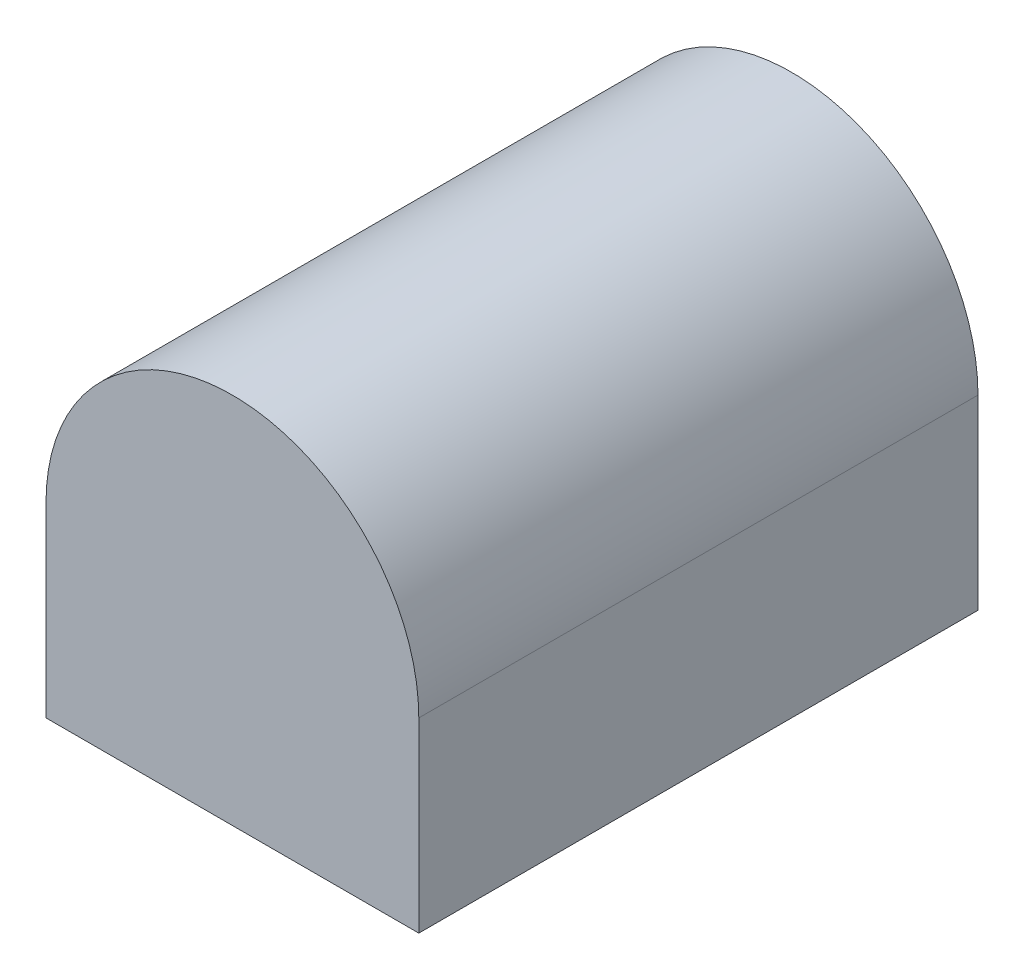
ISO-10303-21;
HEADER;
FILE_DESCRIPTION(('STEP AP214'),'2;1');
FILE_NAME('part.step','',(''),(''),'','','');
FILE_SCHEMA(('AUTOMOTIVE_DESIGN { 1 0 10303 214 1 1 1 1 }'));
ENDSEC;
DATA;
#1=APPLICATION_CONTEXT('core data for automotive mechanical design processes');
#2=APPLICATION_PROTOCOL_DEFINITION('international standard','automotive_design',2000,#1);
#3=PRODUCT_CONTEXT('',#1,'mechanical');
#4=PRODUCT('Part','Part','',(#3));
#5=PRODUCT_RELATED_PRODUCT_CATEGORY('part','',(#4));
#6=PRODUCT_DEFINITION_FORMATION('','',#4);
#7=PRODUCT_DEFINITION_CONTEXT('part definition',#1,'design');
#8=PRODUCT_DEFINITION('design','',#6,#7);
#9=PRODUCT_DEFINITION_SHAPE('','',#8);
#10=(LENGTH_UNIT() NAMED_UNIT(*) SI_UNIT(.MILLI.,.METRE.));
#11=(NAMED_UNIT(*) PLANE_ANGLE_UNIT() SI_UNIT($,.RADIAN.));
#12=(NAMED_UNIT(*) SI_UNIT($,.STERADIAN.) SOLID_ANGLE_UNIT());
#13=UNCERTAINTY_MEASURE_WITH_UNIT(LENGTH_MEASURE(1.E-05),#10,'distance_accuracy_value','');
#14=(GEOMETRIC_REPRESENTATION_CONTEXT(3) GLOBAL_UNCERTAINTY_ASSIGNED_CONTEXT((#13)) GLOBAL_UNIT_ASSIGNED_CONTEXT((#10,
#11,#12)) REPRESENTATION_CONTEXT('',''));
#15=CARTESIAN_POINT('',(0.,0.,0.));
#16=DIRECTION('',(0.,0.,1.));
#17=DIRECTION('',(1.,0.,0.));
#18=AXIS2_PLACEMENT_3D('',#15,#16,#17);
#19=CARTESIAN_POINT('',(-1.,0.,1.5));
#20=DIRECTION('',(1.,0.,0.));
#21=DIRECTION('',(0.,0.,-1.));
#22=AXIS2_PLACEMENT_3D('',#19,#20,#21);
#23=PLANE('',#22);
#24=DIRECTION('',(0.,-1.,0.));
#25=VECTOR('',#24,1.);
#26=CARTESIAN_POINT('',(-1.,0.,-1.5));
#27=LINE('',#26,#25);
#28=CARTESIAN_POINT('',(-1.,1.,-1.5));
#29=VERTEX_POINT('',#28);
#30=CARTESIAN_POINT('',(-1.,0.,-1.5));
#31=VERTEX_POINT('',#30);
#32=EDGE_CURVE('E108',#29,#31,#27,.T.);
#33=ORIENTED_EDGE('',*,*,#32,.T.);
#34=DIRECTION('',(0.,0.,-1.));
#35=VECTOR('',#34,1.);
#36=CARTESIAN_POINT('',(-1.,0.,1.5));
#37=LINE('',#36,#35);
#38=CARTESIAN_POINT('',(-1.,0.,1.5));
#39=VERTEX_POINT('',#38);
#40=EDGE_CURVE('E11',#39,#31,#37,.T.);
#41=ORIENTED_EDGE('',*,*,#40,.F.);
#42=DIRECTION('',(0.,-1.,0.));
#43=VECTOR('',#42,1.);
#44=CARTESIAN_POINT('',(-1.,0.,1.5));
#45=LINE('',#44,#43);
#46=CARTESIAN_POINT('',(-1.,1.,1.5));
#47=VERTEX_POINT('',#46);
#48=EDGE_CURVE('E96',#47,#39,#45,.T.);
#49=ORIENTED_EDGE('',*,*,#48,.F.);
#50=DIRECTION('',(0.,0.,-1.));
#51=VECTOR('',#50,1.);
#52=CARTESIAN_POINT('',(-1.,1.,1.5));
#53=LINE('',#52,#51);
#54=EDGE_CURVE('E104',#47,#29,#53,.T.);
#55=ORIENTED_EDGE('',*,*,#54,.T.);
#56=EDGE_LOOP('',(#33,#41,#49,#55));
#57=FACE_BOUND('',#56,.T.);
#58=ADVANCED_FACE('F45',(#57),#23,.F.);
#59=CARTESIAN_POINT('',(-1.,0.,1.5));
#60=DIRECTION('',(0.,1.,0.));
#61=DIRECTION('',(-1.,0.,0.));
#62=AXIS2_PLACEMENT_3D('',#59,#60,#61);
#63=PLANE('',#62);
#64=DIRECTION('',(1.,0.,0.));
#65=VECTOR('',#64,1.);
#66=CARTESIAN_POINT('',(-1.,0.,-1.5));
#67=LINE('',#66,#65);
#68=CARTESIAN_POINT('',(1.,0.,-1.5));
#69=VERTEX_POINT('',#68);
#70=EDGE_CURVE('E100',#31,#69,#67,.T.);
#71=ORIENTED_EDGE('',*,*,#70,.T.);
#72=DIRECTION('',(0.,0.,-1.));
#73=VECTOR('',#72,1.);
#74=CARTESIAN_POINT('',(1.,0.,1.5));
#75=LINE('',#74,#73);
#76=CARTESIAN_POINT('',(1.,0.,1.5));
#77=VERTEX_POINT('',#76);
#78=EDGE_CURVE('E53',#77,#69,#75,.T.);
#79=ORIENTED_EDGE('',*,*,#78,.F.);
#80=DIRECTION('',(1.,0.,0.));
#81=VECTOR('',#80,1.);
#82=CARTESIAN_POINT('',(-1.,0.,1.5));
#83=LINE('',#82,#81);
#84=EDGE_CURVE('E91',#39,#77,#83,.T.);
#85=ORIENTED_EDGE('',*,*,#84,.F.);
#86=ORIENTED_EDGE('',*,*,#40,.T.);
#87=EDGE_LOOP('',(#71,#79,#85,#86));
#88=FACE_BOUND('',#87,.T.);
#89=ADVANCED_FACE('F99',(#88),#63,.F.);
#90=CARTESIAN_POINT('',(1.,1.,1.5));
#91=DIRECTION('',(-1.,0.,0.));
#92=DIRECTION('',(0.,-1.,0.));
#93=AXIS2_PLACEMENT_3D('',#90,#91,#92);
#94=PLANE('',#93);
#95=DIRECTION('',(0.,1.,0.));
#96=VECTOR('',#95,1.);
#97=CARTESIAN_POINT('',(1.,1.,-1.5));
#98=LINE('',#97,#96);
#99=CARTESIAN_POINT('',(1.,1.,-1.5));
#100=VERTEX_POINT('',#99);
#101=EDGE_CURVE('E78',#69,#100,#98,.T.);
#102=ORIENTED_EDGE('',*,*,#101,.T.);
#103=DIRECTION('',(0.,0.,-1.));
#104=VECTOR('',#103,1.);
#105=CARTESIAN_POINT('',(1.,1.,1.5));
#106=LINE('',#105,#104);
#107=CARTESIAN_POINT('',(1.,1.,1.5));
#108=VERTEX_POINT('',#107);
#109=EDGE_CURVE('E101',#108,#100,#106,.T.);
#110=ORIENTED_EDGE('',*,*,#109,.F.);
#111=DIRECTION('',(0.,1.,0.));
#112=VECTOR('',#111,1.);
#113=CARTESIAN_POINT('',(1.,1.,1.5));
#114=LINE('',#113,#112);
#115=EDGE_CURVE('E94',#77,#108,#114,.T.);
#116=ORIENTED_EDGE('',*,*,#115,.F.);
#117=ORIENTED_EDGE('',*,*,#78,.T.);
#118=EDGE_LOOP('',(#102,#110,#116,#117));
#119=FACE_BOUND('',#118,.T.);
#120=ADVANCED_FACE('F102',(#119),#94,.F.);
#121=CARTESIAN_POINT('',(0.,1.,1.5));
#122=DIRECTION('',(0.,0.,-1.));
#123=DIRECTION('',(-1.,0.,0.));
#124=AXIS2_PLACEMENT_3D('',#121,#122,#123);
#125=CYLINDRICAL_SURFACE('',#124,1.);
#126=CARTESIAN_POINT('',(0.,1.,-1.5));
#127=DIRECTION('',(0.,0.,1.));
#128=DIRECTION('',(1.,0.,0.));
#129=AXIS2_PLACEMENT_3D('',#126,#127,#128);
#130=CIRCLE('',#129,1.);
#131=EDGE_CURVE('E84',#100,#29,#130,.T.);
#132=ORIENTED_EDGE('',*,*,#131,.T.);
#133=ORIENTED_EDGE('',*,*,#54,.F.);
#134=CARTESIAN_POINT('',(0.,1.,1.5));
#135=DIRECTION('',(0.,0.,1.));
#136=DIRECTION('',(1.,0.,0.));
#137=AXIS2_PLACEMENT_3D('',#134,#135,#136);
#138=CIRCLE('',#137,1.);
#139=EDGE_CURVE('E61',#108,#47,#138,.T.);
#140=ORIENTED_EDGE('',*,*,#139,.F.);
#141=ORIENTED_EDGE('',*,*,#109,.T.);
#142=EDGE_LOOP('',(#132,#133,#140,#141));
#143=FACE_BOUND('',#142,.T.);
#144=ADVANCED_FACE('F115',(#143),#125,.T.);
#145=CARTESIAN_POINT('',(0.,1.,1.5));
#146=DIRECTION('',(0.,0.,1.));
#147=DIRECTION('',(1.,0.,0.));
#148=AXIS2_PLACEMENT_3D('',#145,#146,#147);
#149=PLANE('',#148);
#150=ORIENTED_EDGE('',*,*,#48,.T.);
#151=ORIENTED_EDGE('',*,*,#84,.T.);
#152=ORIENTED_EDGE('',*,*,#115,.T.);
#153=ORIENTED_EDGE('',*,*,#139,.T.);
#154=EDGE_LOOP('',(#150,#151,#152,#153));
#155=FACE_BOUND('',#154,.T.);
#156=ADVANCED_FACE('F92',(#155),#149,.T.);
#157=CARTESIAN_POINT('',(0.,1.,-1.5));
#158=DIRECTION('',(0.,0.,1.));
#159=DIRECTION('',(1.,0.,0.));
#160=AXIS2_PLACEMENT_3D('',#157,#158,#159);
#161=PLANE('',#160);
#162=ORIENTED_EDGE('',*,*,#32,.F.);
#163=ORIENTED_EDGE('',*,*,#131,.F.);
#164=ORIENTED_EDGE('',*,*,#101,.F.);
#165=ORIENTED_EDGE('',*,*,#70,.F.);
#166=EDGE_LOOP('',(#162,#163,#164,#165));
#167=FACE_BOUND('',#166,.T.);
#168=ADVANCED_FACE('F118',(#167),#161,.F.);
#169=CLOSED_SHELL('',(#58,#89,#120,#144,#156,#168));
#170=MANIFOLD_SOLID_BREP('B2',#169);
#171=ADVANCED_BREP_SHAPE_REPRESENTATION('',(#18,#170),#14);
#172=SHAPE_DEFINITION_REPRESENTATION(#9,#171);
ENDSEC;
END-ISO-10303-21;
